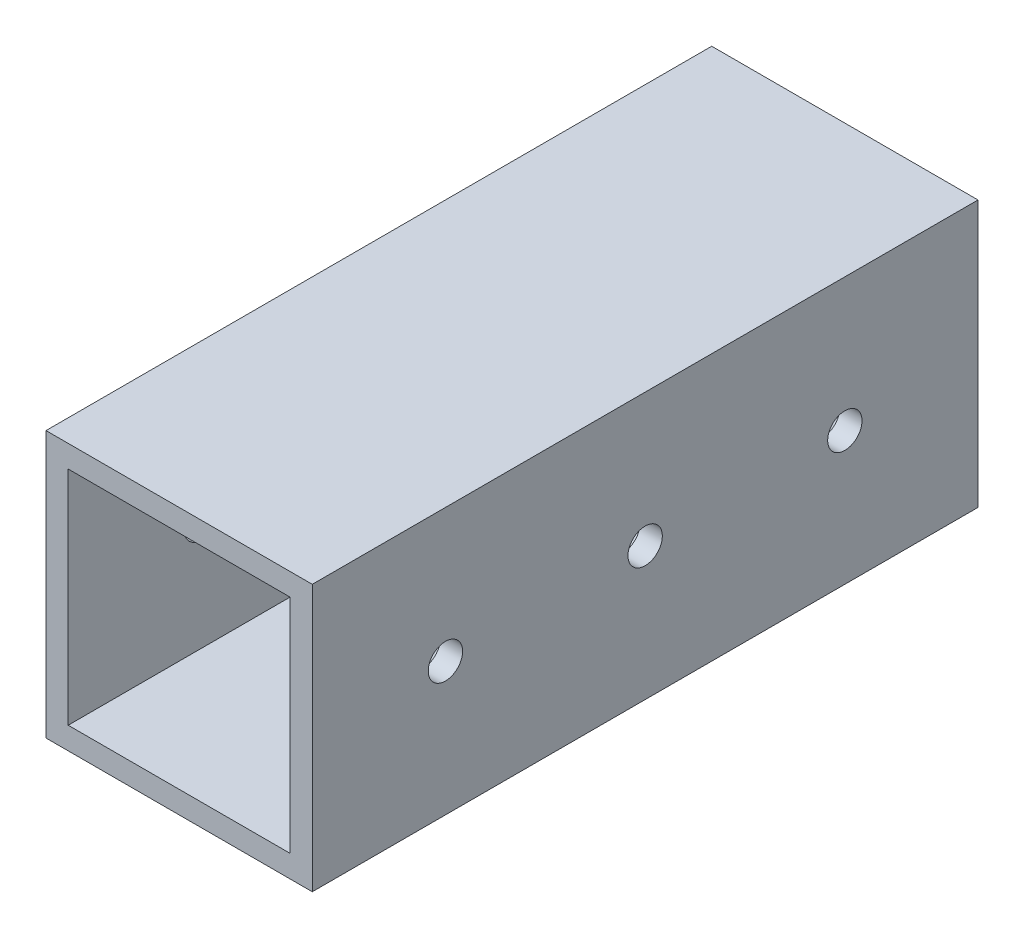
ISO-10303-21;
HEADER;
FILE_DESCRIPTION(('STEP AP214'),'2;1');
FILE_NAME('part.step','',(''),(''),'','','');
FILE_SCHEMA(('AUTOMOTIVE_DESIGN { 1 0 10303 214 1 1 1 1 }'));
ENDSEC;
DATA;
#1=APPLICATION_CONTEXT('core data for automotive mechanical design processes');
#2=APPLICATION_PROTOCOL_DEFINITION('international standard','automotive_design',2000,#1);
#3=PRODUCT_CONTEXT('',#1,'mechanical');
#4=PRODUCT('Part','Part','',(#3));
#5=PRODUCT_RELATED_PRODUCT_CATEGORY('part','',(#4));
#6=PRODUCT_DEFINITION_FORMATION('','',#4);
#7=PRODUCT_DEFINITION_CONTEXT('part definition',#1,'design');
#8=PRODUCT_DEFINITION('design','',#6,#7);
#9=PRODUCT_DEFINITION_SHAPE('','',#8);
#10=(LENGTH_UNIT() NAMED_UNIT(*) SI_UNIT(.MILLI.,.METRE.));
#11=(NAMED_UNIT(*) PLANE_ANGLE_UNIT() SI_UNIT($,.RADIAN.));
#12=(NAMED_UNIT(*) SI_UNIT($,.STERADIAN.) SOLID_ANGLE_UNIT());
#13=UNCERTAINTY_MEASURE_WITH_UNIT(LENGTH_MEASURE(1.E-05),#10,'distance_accuracy_value','');
#14=(GEOMETRIC_REPRESENTATION_CONTEXT(3) GLOBAL_UNCERTAINTY_ASSIGNED_CONTEXT((#13)) GLOBAL_UNIT_ASSIGNED_CONTEXT((#10,
#11,#12)) REPRESENTATION_CONTEXT('',''));
#15=CARTESIAN_POINT('',(0.,0.,0.));
#16=DIRECTION('',(0.,0.,1.));
#17=DIRECTION('',(1.,0.,0.));
#18=AXIS2_PLACEMENT_3D('',#15,#16,#17);
#19=CARTESIAN_POINT('',(0.,0.,95.25));
#20=DIRECTION('',(0.,0.,-1.));
#21=DIRECTION('',(-1.00000000000001,0.,0.));
#22=AXIS2_PLACEMENT_3D('',#19,#20,#21);
#23=PLANE('',#22);
#24=DIRECTION('',(0.,1.00000000000001,0.));
#25=VECTOR('',#24,1.);
#26=CARTESIAN_POINT('',(19.0500000000001,-19.05,95.25));
#27=LINE('',#26,#25);
#28=CARTESIAN_POINT('',(19.0500000000001,-19.05,95.25));
#29=VERTEX_POINT('',#28);
#30=CARTESIAN_POINT('',(19.0500000000002,19.05,95.25));
#31=VERTEX_POINT('',#30);
#32=EDGE_CURVE('E155',#29,#31,#27,.T.);
#33=ORIENTED_EDGE('',*,*,#32,.T.);
#34=DIRECTION('',(-1.00000000000001,0.,0.));
#35=VECTOR('',#34,1.);
#36=CARTESIAN_POINT('',(-19.05,19.05,95.25));
#37=LINE('',#36,#35);
#38=CARTESIAN_POINT('',(-19.05,19.05,95.25));
#39=VERTEX_POINT('',#38);
#40=EDGE_CURVE('E159',#31,#39,#37,.T.);
#41=ORIENTED_EDGE('',*,*,#40,.T.);
#42=DIRECTION('',(0.,-1.00000000000001,0.));
#43=VECTOR('',#42,1.);
#44=CARTESIAN_POINT('',(-19.0500000000003,-19.05,95.25));
#45=LINE('',#44,#43);
#46=CARTESIAN_POINT('',(-19.0500000000003,-19.05,95.25));
#47=VERTEX_POINT('',#46);
#48=EDGE_CURVE('E163',#39,#47,#45,.T.);
#49=ORIENTED_EDGE('',*,*,#48,.T.);
#50=DIRECTION('',(1.00000000000001,0.,0.));
#51=VECTOR('',#50,1.);
#52=CARTESIAN_POINT('',(-19.0500000000003,-19.05,95.25));
#53=LINE('',#52,#51);
#54=EDGE_CURVE('E166',#47,#29,#53,.T.);
#55=ORIENTED_EDGE('',*,*,#54,.T.);
#56=EDGE_LOOP('',(#33,#41,#49,#55));
#57=FACE_BOUND('',#56,.T.);
#58=DIRECTION('',(0.,-1.00000000000001,0.));
#59=VECTOR('',#58,1.);
#60=CARTESIAN_POINT('',(-15.8750000000003,-15.875,95.25));
#61=LINE('',#60,#59);
#62=CARTESIAN_POINT('',(-15.875,15.875,95.25));
#63=VERTEX_POINT('',#62);
#64=CARTESIAN_POINT('',(-15.8750000000003,-15.875,95.25));
#65=VERTEX_POINT('',#64);
#66=EDGE_CURVE('E104',#63,#65,#61,.T.);
#67=ORIENTED_EDGE('',*,*,#66,.F.);
#68=DIRECTION('',(-1.00000000000001,0.,0.));
#69=VECTOR('',#68,1.);
#70=CARTESIAN_POINT('',(-15.875,15.875,95.25));
#71=LINE('',#70,#69);
#72=CARTESIAN_POINT('',(15.8750000000002,15.875,95.25));
#73=VERTEX_POINT('',#72);
#74=EDGE_CURVE('E131',#73,#63,#71,.T.);
#75=ORIENTED_EDGE('',*,*,#74,.F.);
#76=DIRECTION('',(0.,1.00000000000001,0.));
#77=VECTOR('',#76,1.);
#78=CARTESIAN_POINT('',(15.8750000000001,-15.875,95.25));
#79=LINE('',#78,#77);
#80=CARTESIAN_POINT('',(15.8750000000001,-15.875,95.25));
#81=VERTEX_POINT('',#80);
#82=EDGE_CURVE('E126',#81,#73,#79,.T.);
#83=ORIENTED_EDGE('',*,*,#82,.F.);
#84=DIRECTION('',(1.00000000000001,0.,0.));
#85=VECTOR('',#84,1.);
#86=CARTESIAN_POINT('',(-15.8750000000003,-15.875,95.25));
#87=LINE('',#86,#85);
#88=EDGE_CURVE('E113',#65,#81,#87,.T.);
#89=ORIENTED_EDGE('',*,*,#88,.F.);
#90=EDGE_LOOP('',(#67,#75,#83,#89));
#91=FACE_BOUND('',#90,.T.);
#92=ADVANCED_FACE('F36',(#57,#91),#23,.F.);
#93=CARTESIAN_POINT('',(0.,0.,0.));
#94=DIRECTION('',(0.,0.,-1.));
#95=DIRECTION('',(-1.00000000000001,0.,0.));
#96=AXIS2_PLACEMENT_3D('',#93,#94,#95);
#97=PLANE('',#96);
#98=DIRECTION('',(0.,1.00000000000001,0.));
#99=VECTOR('',#98,1.);
#100=CARTESIAN_POINT('',(19.05,-19.05,0.));
#101=LINE('',#100,#99);
#102=CARTESIAN_POINT('',(19.05,-19.05,0.));
#103=VERTEX_POINT('',#102);
#104=CARTESIAN_POINT('',(19.0500000000002,19.05,0.));
#105=VERTEX_POINT('',#104);
#106=EDGE_CURVE('E122',#103,#105,#101,.T.);
#107=ORIENTED_EDGE('',*,*,#106,.F.);
#108=DIRECTION('',(1.00000000000001,0.,0.));
#109=VECTOR('',#108,1.);
#110=CARTESIAN_POINT('',(-19.0500000000003,-19.05,0.));
#111=LINE('',#110,#109);
#112=CARTESIAN_POINT('',(-19.0500000000003,-19.05,0.));
#113=VERTEX_POINT('',#112);
#114=EDGE_CURVE('E160',#113,#103,#111,.T.);
#115=ORIENTED_EDGE('',*,*,#114,.F.);
#116=DIRECTION('',(0.,-1.00000000000001,0.));
#117=VECTOR('',#116,1.);
#118=CARTESIAN_POINT('',(-19.0500000000003,-19.05,0.));
#119=LINE('',#118,#117);
#120=CARTESIAN_POINT('',(-19.05,19.05,0.));
#121=VERTEX_POINT('',#120);
#122=EDGE_CURVE('E176',#121,#113,#119,.T.);
#123=ORIENTED_EDGE('',*,*,#122,.F.);
#124=DIRECTION('',(-1.00000000000001,0.,0.));
#125=VECTOR('',#124,1.);
#126=CARTESIAN_POINT('',(-19.05,19.05,0.));
#127=LINE('',#126,#125);
#128=EDGE_CURVE('E173',#105,#121,#127,.T.);
#129=ORIENTED_EDGE('',*,*,#128,.F.);
#130=EDGE_LOOP('',(#107,#115,#123,#129));
#131=FACE_BOUND('',#130,.T.);
#132=DIRECTION('',(-1.00000000000001,0.,0.));
#133=VECTOR('',#132,1.);
#134=CARTESIAN_POINT('',(-15.875,15.875,0.));
#135=LINE('',#134,#133);
#136=CARTESIAN_POINT('',(15.8750000000002,15.875,0.));
#137=VERTEX_POINT('',#136);
#138=CARTESIAN_POINT('',(-15.875,15.875,0.));
#139=VERTEX_POINT('',#138);
#140=EDGE_CURVE('E114',#137,#139,#135,.T.);
#141=ORIENTED_EDGE('',*,*,#140,.T.);
#142=DIRECTION('',(0.,-1.00000000000001,0.));
#143=VECTOR('',#142,1.);
#144=CARTESIAN_POINT('',(-15.8750000000003,-15.875,0.));
#145=LINE('',#144,#143);
#146=CARTESIAN_POINT('',(-15.8750000000003,-15.875,0.));
#147=VERTEX_POINT('',#146);
#148=EDGE_CURVE('E62',#139,#147,#145,.T.);
#149=ORIENTED_EDGE('',*,*,#148,.T.);
#150=DIRECTION('',(1.00000000000001,0.,0.));
#151=VECTOR('',#150,1.);
#152=CARTESIAN_POINT('',(-15.8750000000003,-15.875,0.));
#153=LINE('',#152,#151);
#154=CARTESIAN_POINT('',(15.875,-15.875,0.));
#155=VERTEX_POINT('',#154);
#156=EDGE_CURVE('E120',#147,#155,#153,.T.);
#157=ORIENTED_EDGE('',*,*,#156,.T.);
#158=DIRECTION('',(0.,1.00000000000001,0.));
#159=VECTOR('',#158,1.);
#160=CARTESIAN_POINT('',(15.875,-15.875,0.));
#161=LINE('',#160,#159);
#162=EDGE_CURVE('E142',#155,#137,#161,.T.);
#163=ORIENTED_EDGE('',*,*,#162,.T.);
#164=EDGE_LOOP('',(#141,#149,#157,#163));
#165=FACE_BOUND('',#164,.T.);
#166=ADVANCED_FACE('F250',(#131,#165),#97,.T.);
#167=CARTESIAN_POINT('',(19.0500000000001,-19.05,95.25));
#168=DIRECTION('',(-1.00000000000001,0.,0.));
#169=DIRECTION('',(0.,0.,1.));
#170=AXIS2_PLACEMENT_3D('',#167,#168,#169);
#171=PLANE('',#170);
#172=CARTESIAN_POINT('',(19.0500000000001,0.,19.05));
#173=DIRECTION('',(1.00000000000001,0.,0.));
#174=DIRECTION('',(0.,0.,-1.));
#175=AXIS2_PLACEMENT_3D('',#172,#173,#174);
#176=CIRCLE('',#175,2.45745);
#177=CARTESIAN_POINT('',(19.0500000000001,0.,16.59255));
#178=VERTEX_POINT('',#177);
#179=EDGE_CURVE('E314',#178,#178,#176,.T.);
#180=ORIENTED_EDGE('',*,*,#179,.F.);
#181=EDGE_LOOP('',(#180));
#182=FACE_BOUND('',#181,.T.);
#183=CARTESIAN_POINT('',(19.0500000000002,0.,76.2));
#184=DIRECTION('',(1.00000000000001,0.,0.));
#185=DIRECTION('',(0.,0.,-1.));
#186=AXIS2_PLACEMENT_3D('',#183,#184,#185);
#187=CIRCLE('',#186,2.45745);
#188=CARTESIAN_POINT('',(19.0500000000002,0.,73.74255));
#189=VERTEX_POINT('',#188);
#190=EDGE_CURVE('E209',#189,#189,#187,.T.);
#191=ORIENTED_EDGE('',*,*,#190,.F.);
#192=EDGE_LOOP('',(#191));
#193=FACE_BOUND('',#192,.T.);
#194=CARTESIAN_POINT('',(19.0500000000002,0.,47.625));
#195=DIRECTION('',(1.00000000000001,0.,0.));
#196=DIRECTION('',(0.,0.,-1.));
#197=AXIS2_PLACEMENT_3D('',#194,#195,#196);
#198=CIRCLE('',#197,2.45745);
#199=CARTESIAN_POINT('',(19.0500000000002,0.,45.16755));
#200=VERTEX_POINT('',#199);
#201=EDGE_CURVE('E206',#200,#200,#198,.T.);
#202=ORIENTED_EDGE('',*,*,#201,.F.);
#203=EDGE_LOOP('',(#202));
#204=FACE_BOUND('',#203,.T.);
#205=ORIENTED_EDGE('',*,*,#106,.T.);
#206=DIRECTION('',(0.,0.,-1.));
#207=VECTOR('',#206,1.);
#208=CARTESIAN_POINT('',(19.0500000000002,19.05,95.25));
#209=LINE('',#208,#207);
#210=EDGE_CURVE('E11',#31,#105,#209,.T.);
#211=ORIENTED_EDGE('',*,*,#210,.F.);
#212=ORIENTED_EDGE('',*,*,#32,.F.);
#213=DIRECTION('',(0.,0.,-1.));
#214=VECTOR('',#213,1.);
#215=CARTESIAN_POINT('',(19.0500000000001,-19.05,95.25));
#216=LINE('',#215,#214);
#217=EDGE_CURVE('E169',#29,#103,#216,.T.);
#218=ORIENTED_EDGE('',*,*,#217,.T.);
#219=EDGE_LOOP('',(#205,#211,#212,#218));
#220=FACE_BOUND('',#219,.T.);
#221=ADVANCED_FACE('F38',(#182,#193,#204,#220),#171,.F.);
#222=CARTESIAN_POINT('',(-19.05,19.05,95.25));
#223=DIRECTION('',(0.,-1.00000000000001,0.));
#224=DIRECTION('',(0.,0.,-1.));
#225=AXIS2_PLACEMENT_3D('',#222,#223,#224);
#226=PLANE('',#225);
#227=ORIENTED_EDGE('',*,*,#128,.T.);
#228=DIRECTION('',(0.,0.,-1.));
#229=VECTOR('',#228,1.);
#230=CARTESIAN_POINT('',(-19.05,19.05,95.25));
#231=LINE('',#230,#229);
#232=EDGE_CURVE('E46',#39,#121,#231,.T.);
#233=ORIENTED_EDGE('',*,*,#232,.F.);
#234=ORIENTED_EDGE('',*,*,#40,.F.);
#235=ORIENTED_EDGE('',*,*,#210,.T.);
#236=EDGE_LOOP('',(#227,#233,#234,#235));
#237=FACE_BOUND('',#236,.T.);
#238=ADVANCED_FACE('F259',(#237),#226,.F.);
#239=CARTESIAN_POINT('',(-19.0500000000003,-19.05,95.25));
#240=DIRECTION('',(1.00000000000001,0.,0.));
#241=DIRECTION('',(0.,0.,-1.));
#242=AXIS2_PLACEMENT_3D('',#239,#240,#241);
#243=PLANE('',#242);
#244=CARTESIAN_POINT('',(-19.0500000000002,0.,19.05));
#245=DIRECTION('',(1.00000000000001,0.,0.));
#246=DIRECTION('',(0.,0.,-1.));
#247=AXIS2_PLACEMENT_3D('',#244,#245,#246);
#248=CIRCLE('',#247,2.45744999999999);
#249=CARTESIAN_POINT('',(-19.0500000000002,0.,16.59255));
#250=VERTEX_POINT('',#249);
#251=EDGE_CURVE('E312',#250,#250,#248,.T.);
#252=ORIENTED_EDGE('',*,*,#251,.T.);
#253=EDGE_LOOP('',(#252));
#254=FACE_BOUND('',#253,.T.);
#255=CARTESIAN_POINT('',(-19.0500000000003,0.,76.2));
#256=DIRECTION('',(1.00000000000001,0.,0.));
#257=DIRECTION('',(0.,0.,-1.));
#258=AXIS2_PLACEMENT_3D('',#255,#256,#257);
#259=CIRCLE('',#258,2.45744999999999);
#260=CARTESIAN_POINT('',(-19.0500000000003,0.,73.74255));
#261=VERTEX_POINT('',#260);
#262=EDGE_CURVE('E199',#261,#261,#259,.T.);
#263=ORIENTED_EDGE('',*,*,#262,.T.);
#264=EDGE_LOOP('',(#263));
#265=FACE_BOUND('',#264,.T.);
#266=CARTESIAN_POINT('',(-19.05,0.,47.625));
#267=DIRECTION('',(1.00000000000001,0.,0.));
#268=DIRECTION('',(0.,0.,-1.));
#269=AXIS2_PLACEMENT_3D('',#266,#267,#268);
#270=CIRCLE('',#269,2.45744999999999);
#271=CARTESIAN_POINT('',(-19.05,0.,45.16755));
#272=VERTEX_POINT('',#271);
#273=EDGE_CURVE('E194',#272,#272,#270,.T.);
#274=ORIENTED_EDGE('',*,*,#273,.T.);
#275=EDGE_LOOP('',(#274));
#276=FACE_BOUND('',#275,.T.);
#277=ORIENTED_EDGE('',*,*,#122,.T.);
#278=DIRECTION('',(0.,0.,-1.));
#279=VECTOR('',#278,1.);
#280=CARTESIAN_POINT('',(-19.0500000000003,-19.05,95.25));
#281=LINE('',#280,#279);
#282=EDGE_CURVE('E184',#47,#113,#281,.T.);
#283=ORIENTED_EDGE('',*,*,#282,.F.);
#284=ORIENTED_EDGE('',*,*,#48,.F.);
#285=ORIENTED_EDGE('',*,*,#232,.T.);
#286=EDGE_LOOP('',(#277,#283,#284,#285));
#287=FACE_BOUND('',#286,.T.);
#288=ADVANCED_FACE('F243',(#254,#265,#276,#287),#243,.F.);
#289=CARTESIAN_POINT('',(-19.0500000000003,-19.05,95.25));
#290=DIRECTION('',(0.,1.00000000000001,0.));
#291=DIRECTION('',(0.,0.,1.));
#292=AXIS2_PLACEMENT_3D('',#289,#290,#291);
#293=PLANE('',#292);
#294=ORIENTED_EDGE('',*,*,#114,.T.);
#295=ORIENTED_EDGE('',*,*,#217,.F.);
#296=ORIENTED_EDGE('',*,*,#54,.F.);
#297=ORIENTED_EDGE('',*,*,#282,.T.);
#298=EDGE_LOOP('',(#294,#295,#296,#297));
#299=FACE_BOUND('',#298,.T.);
#300=ADVANCED_FACE('F234',(#299),#293,.F.);
#301=CARTESIAN_POINT('',(-15.8750000000003,-15.875,95.25));
#302=DIRECTION('',(1.00000000000001,0.,0.));
#303=DIRECTION('',(0.,0.,-1.));
#304=AXIS2_PLACEMENT_3D('',#301,#302,#303);
#305=PLANE('',#304);
#306=CARTESIAN_POINT('',(-15.8750000000002,0.,19.05));
#307=DIRECTION('',(1.00000000000001,0.,0.));
#308=DIRECTION('',(0.,0.,-1.));
#309=AXIS2_PLACEMENT_3D('',#306,#307,#308);
#310=CIRCLE('',#309,2.45744999999999);
#311=CARTESIAN_POINT('',(-15.8750000000002,0.,16.59255));
#312=VERTEX_POINT('',#311);
#313=EDGE_CURVE('E40',#312,#312,#310,.T.);
#314=ORIENTED_EDGE('',*,*,#313,.F.);
#315=EDGE_LOOP('',(#314));
#316=FACE_BOUND('',#315,.T.);
#317=CARTESIAN_POINT('',(-15.8750000000003,0.,76.2));
#318=DIRECTION('',(1.00000000000001,0.,0.));
#319=DIRECTION('',(0.,0.,-1.));
#320=AXIS2_PLACEMENT_3D('',#317,#318,#319);
#321=CIRCLE('',#320,2.45744999999999);
#322=CARTESIAN_POINT('',(-15.8750000000003,0.,73.74255));
#323=VERTEX_POINT('',#322);
#324=EDGE_CURVE('E198',#323,#323,#321,.T.);
#325=ORIENTED_EDGE('',*,*,#324,.F.);
#326=EDGE_LOOP('',(#325));
#327=FACE_BOUND('',#326,.T.);
#328=CARTESIAN_POINT('',(-15.875,0.,47.625));
#329=DIRECTION('',(1.00000000000001,0.,0.));
#330=DIRECTION('',(0.,0.,-1.));
#331=AXIS2_PLACEMENT_3D('',#328,#329,#330);
#332=CIRCLE('',#331,2.45744999999999);
#333=CARTESIAN_POINT('',(-15.875,0.,45.16755));
#334=VERTEX_POINT('',#333);
#335=EDGE_CURVE('E139',#334,#334,#332,.T.);
#336=ORIENTED_EDGE('',*,*,#335,.F.);
#337=EDGE_LOOP('',(#336));
#338=FACE_BOUND('',#337,.T.);
#339=ORIENTED_EDGE('',*,*,#148,.F.);
#340=DIRECTION('',(0.,0.,-1.));
#341=VECTOR('',#340,1.);
#342=CARTESIAN_POINT('',(-15.875,15.875,95.25));
#343=LINE('',#342,#341);
#344=EDGE_CURVE('E108',#63,#139,#343,.T.);
#345=ORIENTED_EDGE('',*,*,#344,.F.);
#346=ORIENTED_EDGE('',*,*,#66,.T.);
#347=DIRECTION('',(0.,0.,-1.));
#348=VECTOR('',#347,1.);
#349=CARTESIAN_POINT('',(-15.8750000000003,-15.875,95.25));
#350=LINE('',#349,#348);
#351=EDGE_CURVE('E107',#65,#147,#350,.T.);
#352=ORIENTED_EDGE('',*,*,#351,.T.);
#353=EDGE_LOOP('',(#339,#345,#346,#352));
#354=FACE_BOUND('',#353,.T.);
#355=ADVANCED_FACE('F106',(#316,#327,#338,#354),#305,.T.);
#356=CARTESIAN_POINT('',(-15.8750000000003,-15.875,95.25));
#357=DIRECTION('',(0.,1.00000000000001,0.));
#358=DIRECTION('',(0.,0.,1.));
#359=AXIS2_PLACEMENT_3D('',#356,#357,#358);
#360=PLANE('',#359);
#361=ORIENTED_EDGE('',*,*,#156,.F.);
#362=ORIENTED_EDGE('',*,*,#351,.F.);
#363=ORIENTED_EDGE('',*,*,#88,.T.);
#364=DIRECTION('',(0.,0.,-1.));
#365=VECTOR('',#364,1.);
#366=CARTESIAN_POINT('',(15.8750000000001,-15.875,95.25));
#367=LINE('',#366,#365);
#368=EDGE_CURVE('E123',#81,#155,#367,.T.);
#369=ORIENTED_EDGE('',*,*,#368,.T.);
#370=EDGE_LOOP('',(#361,#362,#363,#369));
#371=FACE_BOUND('',#370,.T.);
#372=ADVANCED_FACE('F117',(#371),#360,.T.);
#373=CARTESIAN_POINT('',(15.8750000000001,-15.875,95.25));
#374=DIRECTION('',(-1.00000000000001,0.,0.));
#375=DIRECTION('',(0.,0.,1.));
#376=AXIS2_PLACEMENT_3D('',#373,#374,#375);
#377=PLANE('',#376);
#378=CARTESIAN_POINT('',(15.8750000000001,0.,19.05));
#379=DIRECTION('',(-1.00000000000001,0.,0.));
#380=DIRECTION('',(0.,0.,1.));
#381=AXIS2_PLACEMENT_3D('',#378,#379,#380);
#382=CIRCLE('',#381,2.45744999999999);
#383=CARTESIAN_POINT('',(15.8750000000001,0.,21.50745));
#384=VERTEX_POINT('',#383);
#385=EDGE_CURVE('E216',#384,#384,#382,.T.);
#386=ORIENTED_EDGE('',*,*,#385,.F.);
#387=EDGE_LOOP('',(#386));
#388=FACE_BOUND('',#387,.T.);
#389=CARTESIAN_POINT('',(15.8750000000001,0.,76.2));
#390=DIRECTION('',(-1.00000000000001,0.,0.));
#391=DIRECTION('',(0.,0.,1.));
#392=AXIS2_PLACEMENT_3D('',#389,#390,#391);
#393=CIRCLE('',#392,2.45744999999999);
#394=CARTESIAN_POINT('',(15.8750000000001,0.,78.65745));
#395=VERTEX_POINT('',#394);
#396=EDGE_CURVE('E195',#395,#395,#393,.T.);
#397=ORIENTED_EDGE('',*,*,#396,.F.);
#398=EDGE_LOOP('',(#397));
#399=FACE_BOUND('',#398,.T.);
#400=CARTESIAN_POINT('',(15.8750000000002,0.,47.625));
#401=DIRECTION('',(-1.00000000000001,0.,0.));
#402=DIRECTION('',(0.,0.,1.));
#403=AXIS2_PLACEMENT_3D('',#400,#401,#402);
#404=CIRCLE('',#403,2.45744999999999);
#405=CARTESIAN_POINT('',(15.8750000000002,0.,50.08245));
#406=VERTEX_POINT('',#405);
#407=EDGE_CURVE('E191',#406,#406,#404,.T.);
#408=ORIENTED_EDGE('',*,*,#407,.F.);
#409=EDGE_LOOP('',(#408));
#410=FACE_BOUND('',#409,.T.);
#411=ORIENTED_EDGE('',*,*,#162,.F.);
#412=ORIENTED_EDGE('',*,*,#368,.F.);
#413=ORIENTED_EDGE('',*,*,#82,.T.);
#414=DIRECTION('',(0.,0.,-1.));
#415=VECTOR('',#414,1.);
#416=CARTESIAN_POINT('',(15.8750000000002,15.875,95.25));
#417=LINE('',#416,#415);
#418=EDGE_CURVE('E54',#73,#137,#417,.T.);
#419=ORIENTED_EDGE('',*,*,#418,.T.);
#420=EDGE_LOOP('',(#411,#412,#413,#419));
#421=FACE_BOUND('',#420,.T.);
#422=ADVANCED_FACE('F241',(#388,#399,#410,#421),#377,.T.);
#423=CARTESIAN_POINT('',(-15.875,15.875,95.25));
#424=DIRECTION('',(0.,-1.00000000000001,0.));
#425=DIRECTION('',(0.,0.,-1.));
#426=AXIS2_PLACEMENT_3D('',#423,#424,#425);
#427=PLANE('',#426);
#428=ORIENTED_EDGE('',*,*,#140,.F.);
#429=ORIENTED_EDGE('',*,*,#418,.F.);
#430=ORIENTED_EDGE('',*,*,#74,.T.);
#431=ORIENTED_EDGE('',*,*,#344,.T.);
#432=EDGE_LOOP('',(#428,#429,#430,#431));
#433=FACE_BOUND('',#432,.T.);
#434=ADVANCED_FACE('F281',(#433),#427,.T.);
#435=CARTESIAN_POINT('',(19.0500000000002,0.,47.625));
#436=DIRECTION('',(1.00000000000001,0.,0.));
#437=DIRECTION('',(0.,0.,-1.));
#438=AXIS2_PLACEMENT_3D('',#435,#436,#437);
#439=CYLINDRICAL_SURFACE('',#438,2.45744999999999);
#440=ORIENTED_EDGE('',*,*,#407,.T.);
#441=EDGE_LOOP('',(#440));
#442=FACE_BOUND('',#441,.T.);
#443=ORIENTED_EDGE('',*,*,#201,.T.);
#444=EDGE_LOOP('',(#443));
#445=FACE_BOUND('',#444,.T.);
#446=ADVANCED_FACE('F283',(#442,#445),#439,.F.);
#447=ORIENTED_EDGE('',*,*,#335,.T.);
#448=EDGE_LOOP('',(#447));
#449=FACE_BOUND('',#448,.T.);
#450=ORIENTED_EDGE('',*,*,#273,.F.);
#451=EDGE_LOOP('',(#450));
#452=FACE_BOUND('',#451,.T.);
#453=ADVANCED_FACE('F230',(#449,#452),#439,.F.);
#454=CARTESIAN_POINT('',(19.0500000000002,0.,76.2));
#455=DIRECTION('',(1.00000000000001,0.,0.));
#456=DIRECTION('',(0.,0.,-1.));
#457=AXIS2_PLACEMENT_3D('',#454,#455,#456);
#458=CYLINDRICAL_SURFACE('',#457,2.45744999999999);
#459=ORIENTED_EDGE('',*,*,#396,.T.);
#460=EDGE_LOOP('',(#459));
#461=FACE_BOUND('',#460,.T.);
#462=ORIENTED_EDGE('',*,*,#190,.T.);
#463=EDGE_LOOP('',(#462));
#464=FACE_BOUND('',#463,.T.);
#465=ADVANCED_FACE('F294',(#461,#464),#458,.F.);
#466=ORIENTED_EDGE('',*,*,#324,.T.);
#467=EDGE_LOOP('',(#466));
#468=FACE_BOUND('',#467,.T.);
#469=ORIENTED_EDGE('',*,*,#262,.F.);
#470=EDGE_LOOP('',(#469));
#471=FACE_BOUND('',#470,.T.);
#472=ADVANCED_FACE('F297',(#468,#471),#458,.F.);
#473=CARTESIAN_POINT('',(19.0500000000001,0.,19.05));
#474=DIRECTION('',(1.00000000000001,0.,0.));
#475=DIRECTION('',(0.,0.,-1.));
#476=AXIS2_PLACEMENT_3D('',#473,#474,#475);
#477=CYLINDRICAL_SURFACE('',#476,2.45744999999999);
#478=ORIENTED_EDGE('',*,*,#313,.T.);
#479=EDGE_LOOP('',(#478));
#480=FACE_BOUND('',#479,.T.);
#481=ORIENTED_EDGE('',*,*,#251,.F.);
#482=EDGE_LOOP('',(#481));
#483=FACE_BOUND('',#482,.T.);
#484=ADVANCED_FACE('F298',(#480,#483),#477,.F.);
#485=ORIENTED_EDGE('',*,*,#385,.T.);
#486=EDGE_LOOP('',(#485));
#487=FACE_BOUND('',#486,.T.);
#488=ORIENTED_EDGE('',*,*,#179,.T.);
#489=EDGE_LOOP('',(#488));
#490=FACE_BOUND('',#489,.T.);
#491=ADVANCED_FACE('F300',(#487,#490),#477,.F.);
#492=CLOSED_SHELL('',(#92,#166,#221,#238,#288,#300,#355,#372,#422,#434,#446,#453,#465,#472,#484,#491));
#493=MANIFOLD_SOLID_BREP('B2',#492);
#494=ADVANCED_BREP_SHAPE_REPRESENTATION('',(#18,#493),#14);
#495=SHAPE_DEFINITION_REPRESENTATION(#9,#494);
ENDSEC;
END-ISO-10303-21;
